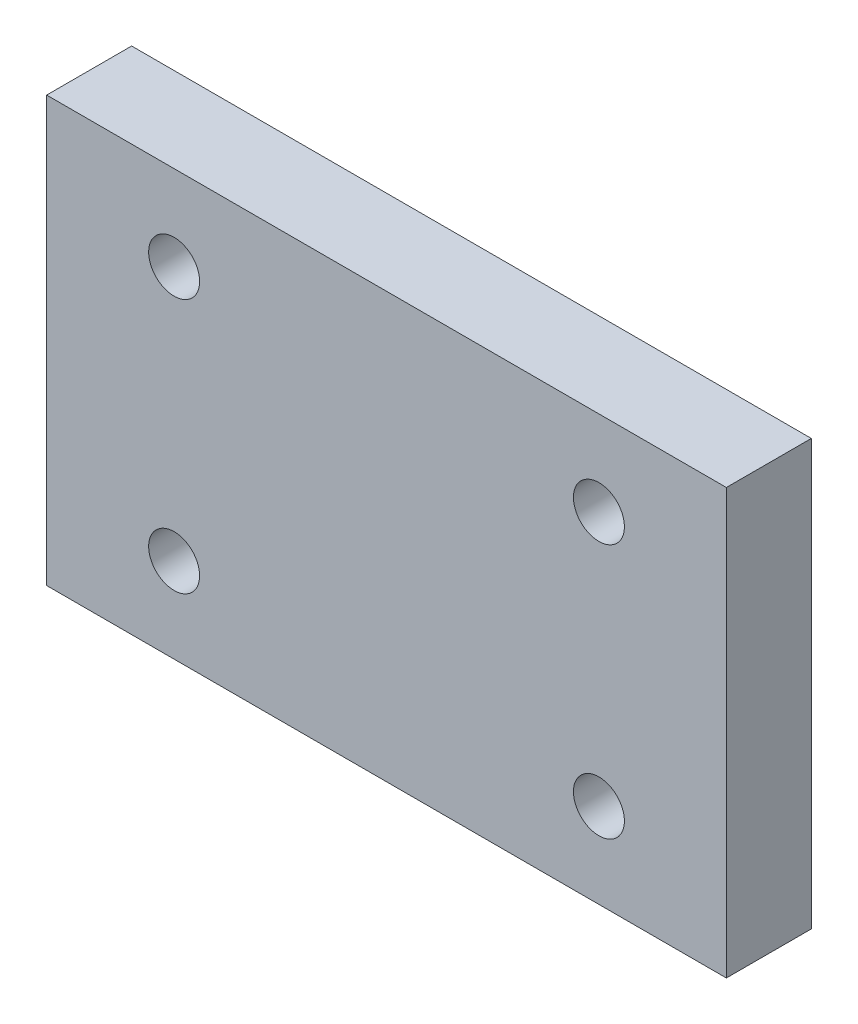
ISO-10303-21;
HEADER;
FILE_DESCRIPTION(('STEP AP214'),'2;1');
FILE_NAME('part.step','',(''),(''),'','','');
FILE_SCHEMA(('AUTOMOTIVE_DESIGN { 1 0 10303 214 1 1 1 1 }'));
ENDSEC;
DATA;
#1=APPLICATION_CONTEXT('core data for automotive mechanical design processes');
#2=APPLICATION_PROTOCOL_DEFINITION('international standard','automotive_design',2000,#1);
#3=PRODUCT_CONTEXT('',#1,'mechanical');
#4=PRODUCT('Part','Part','',(#3));
#5=PRODUCT_RELATED_PRODUCT_CATEGORY('part','',(#4));
#6=PRODUCT_DEFINITION_FORMATION('','',#4);
#7=PRODUCT_DEFINITION_CONTEXT('part definition',#1,'design');
#8=PRODUCT_DEFINITION('design','',#6,#7);
#9=PRODUCT_DEFINITION_SHAPE('','',#8);
#10=(LENGTH_UNIT() NAMED_UNIT(*) SI_UNIT(.MILLI.,.METRE.));
#11=(NAMED_UNIT(*) PLANE_ANGLE_UNIT() SI_UNIT($,.RADIAN.));
#12=(NAMED_UNIT(*) SI_UNIT($,.STERADIAN.) SOLID_ANGLE_UNIT());
#13=UNCERTAINTY_MEASURE_WITH_UNIT(LENGTH_MEASURE(1.E-05),#10,'distance_accuracy_value','');
#14=(GEOMETRIC_REPRESENTATION_CONTEXT(3) GLOBAL_UNCERTAINTY_ASSIGNED_CONTEXT((#13)) GLOBAL_UNIT_ASSIGNED_CONTEXT((#10,
#11,#12)) REPRESENTATION_CONTEXT('',''));
#15=CARTESIAN_POINT('',(0.,0.,0.));
#16=DIRECTION('',(0.,0.,1.));
#17=DIRECTION('',(1.,0.,0.));
#18=AXIS2_PLACEMENT_3D('',#15,#16,#17);
#19=CARTESIAN_POINT('',(40.,-25.,10.));
#20=DIRECTION('',(-1.,0.,0.));
#21=DIRECTION('',(0.,0.,1.));
#22=AXIS2_PLACEMENT_3D('',#19,#20,#21);
#23=PLANE('',#22);
#24=DIRECTION('',(0.,1.,0.));
#25=VECTOR('',#24,1.);
#26=CARTESIAN_POINT('',(40.,-25.,0.));
#27=LINE('',#26,#25);
#28=CARTESIAN_POINT('',(40.,-25.,0.));
#29=VERTEX_POINT('',#28);
#30=CARTESIAN_POINT('',(40.,25.,0.));
#31=VERTEX_POINT('',#30);
#32=EDGE_CURVE('E111',#29,#31,#27,.T.);
#33=ORIENTED_EDGE('',*,*,#32,.T.);
#34=DIRECTION('',(0.,0.,-1.));
#35=VECTOR('',#34,1.);
#36=CARTESIAN_POINT('',(40.,25.,10.));
#37=LINE('',#36,#35);
#38=CARTESIAN_POINT('',(40.,25.,10.));
#39=VERTEX_POINT('',#38);
#40=EDGE_CURVE('E11',#39,#31,#37,.T.);
#41=ORIENTED_EDGE('',*,*,#40,.F.);
#42=DIRECTION('',(0.,1.,0.));
#43=VECTOR('',#42,1.);
#44=CARTESIAN_POINT('',(40.,-25.,10.));
#45=LINE('',#44,#43);
#46=CARTESIAN_POINT('',(40.,-25.,10.));
#47=VERTEX_POINT('',#46);
#48=EDGE_CURVE('E99',#47,#39,#45,.T.);
#49=ORIENTED_EDGE('',*,*,#48,.F.);
#50=DIRECTION('',(0.,0.,-1.));
#51=VECTOR('',#50,1.);
#52=CARTESIAN_POINT('',(40.,-25.,10.));
#53=LINE('',#52,#51);
#54=EDGE_CURVE('E107',#47,#29,#53,.T.);
#55=ORIENTED_EDGE('',*,*,#54,.T.);
#56=EDGE_LOOP('',(#33,#41,#49,#55));
#57=FACE_BOUND('',#56,.T.);
#58=ADVANCED_FACE('F47',(#57),#23,.F.);
#59=CARTESIAN_POINT('',(-40.,25.,10.));
#60=DIRECTION('',(0.,-1.,0.));
#61=DIRECTION('',(0.,0.,-1.));
#62=AXIS2_PLACEMENT_3D('',#59,#60,#61);
#63=PLANE('',#62);
#64=DIRECTION('',(-1.,0.,0.));
#65=VECTOR('',#64,1.);
#66=CARTESIAN_POINT('',(-40.,25.,0.));
#67=LINE('',#66,#65);
#68=CARTESIAN_POINT('',(-40.,25.,0.));
#69=VERTEX_POINT('',#68);
#70=EDGE_CURVE('E103',#31,#69,#67,.T.);
#71=ORIENTED_EDGE('',*,*,#70,.T.);
#72=DIRECTION('',(0.,0.,-1.));
#73=VECTOR('',#72,1.);
#74=CARTESIAN_POINT('',(-40.,25.,10.));
#75=LINE('',#74,#73);
#76=CARTESIAN_POINT('',(-40.,25.,10.));
#77=VERTEX_POINT('',#76);
#78=EDGE_CURVE('E56',#77,#69,#75,.T.);
#79=ORIENTED_EDGE('',*,*,#78,.F.);
#80=DIRECTION('',(-1.,0.,0.));
#81=VECTOR('',#80,1.);
#82=CARTESIAN_POINT('',(-40.,25.,10.));
#83=LINE('',#82,#81);
#84=EDGE_CURVE('E94',#39,#77,#83,.T.);
#85=ORIENTED_EDGE('',*,*,#84,.F.);
#86=ORIENTED_EDGE('',*,*,#40,.T.);
#87=EDGE_LOOP('',(#71,#79,#85,#86));
#88=FACE_BOUND('',#87,.T.);
#89=ADVANCED_FACE('F102',(#88),#63,.F.);
#90=CARTESIAN_POINT('',(-40.,-25.,10.));
#91=DIRECTION('',(1.,0.,0.));
#92=DIRECTION('',(0.,0.,-1.));
#93=AXIS2_PLACEMENT_3D('',#90,#91,#92);
#94=PLANE('',#93);
#95=DIRECTION('',(0.,-1.,0.));
#96=VECTOR('',#95,1.);
#97=CARTESIAN_POINT('',(-40.,-25.,0.));
#98=LINE('',#97,#96);
#99=CARTESIAN_POINT('',(-40.,-25.,0.));
#100=VERTEX_POINT('',#99);
#101=EDGE_CURVE('E81',#69,#100,#98,.T.);
#102=ORIENTED_EDGE('',*,*,#101,.T.);
#103=DIRECTION('',(0.,0.,-1.));
#104=VECTOR('',#103,1.);
#105=CARTESIAN_POINT('',(-40.,-25.,10.));
#106=LINE('',#105,#104);
#107=CARTESIAN_POINT('',(-40.,-25.,10.));
#108=VERTEX_POINT('',#107);
#109=EDGE_CURVE('E104',#108,#100,#106,.T.);
#110=ORIENTED_EDGE('',*,*,#109,.F.);
#111=DIRECTION('',(0.,-1.,0.));
#112=VECTOR('',#111,1.);
#113=CARTESIAN_POINT('',(-40.,-25.,10.));
#114=LINE('',#113,#112);
#115=EDGE_CURVE('E97',#77,#108,#114,.T.);
#116=ORIENTED_EDGE('',*,*,#115,.F.);
#117=ORIENTED_EDGE('',*,*,#78,.T.);
#118=EDGE_LOOP('',(#102,#110,#116,#117));
#119=FACE_BOUND('',#118,.T.);
#120=ADVANCED_FACE('F105',(#119),#94,.F.);
#121=CARTESIAN_POINT('',(-40.,-25.,10.));
#122=DIRECTION('',(0.,1.,0.));
#123=DIRECTION('',(0.,0.,1.));
#124=AXIS2_PLACEMENT_3D('',#121,#122,#123);
#125=PLANE('',#124);
#126=DIRECTION('',(1.,0.,0.));
#127=VECTOR('',#126,1.);
#128=CARTESIAN_POINT('',(-40.,-25.,0.));
#129=LINE('',#128,#127);
#130=EDGE_CURVE('E87',#100,#29,#129,.T.);
#131=ORIENTED_EDGE('',*,*,#130,.T.);
#132=ORIENTED_EDGE('',*,*,#54,.F.);
#133=DIRECTION('',(1.,0.,0.));
#134=VECTOR('',#133,1.);
#135=CARTESIAN_POINT('',(-40.,-25.,10.));
#136=LINE('',#135,#134);
#137=EDGE_CURVE('E64',#108,#47,#136,.T.);
#138=ORIENTED_EDGE('',*,*,#137,.F.);
#139=ORIENTED_EDGE('',*,*,#109,.T.);
#140=EDGE_LOOP('',(#131,#132,#138,#139));
#141=FACE_BOUND('',#140,.T.);
#142=ADVANCED_FACE('F119',(#141),#125,.F.);
#143=CARTESIAN_POINT('',(0.,0.,10.));
#144=DIRECTION('',(0.,0.,-1.));
#145=DIRECTION('',(-1.,0.,0.));
#146=AXIS2_PLACEMENT_3D('',#143,#144,#145);
#147=PLANE('',#146);
#148=CARTESIAN_POINT('',(-25.,-15.,10.));
#149=DIRECTION('',(0.,0.,-1.));
#150=DIRECTION('',(-1.,0.,0.));
#151=AXIS2_PLACEMENT_3D('',#148,#149,#150);
#152=CIRCLE('',#151,3.);
#153=CARTESIAN_POINT('',(-28.,-15.,10.));
#154=VERTEX_POINT('',#153);
#155=EDGE_CURVE('E128',#154,#154,#152,.T.);
#156=ORIENTED_EDGE('',*,*,#155,.T.);
#157=EDGE_LOOP('',(#156));
#158=FACE_BOUND('',#157,.T.);
#159=CARTESIAN_POINT('',(25.,15.,10.));
#160=DIRECTION('',(0.,0.,-1.));
#161=DIRECTION('',(-1.,0.,0.));
#162=AXIS2_PLACEMENT_3D('',#159,#160,#161);
#163=CIRCLE('',#162,3.);
#164=CARTESIAN_POINT('',(22.,15.,10.));
#165=VERTEX_POINT('',#164);
#166=EDGE_CURVE('E134',#165,#165,#163,.T.);
#167=ORIENTED_EDGE('',*,*,#166,.T.);
#168=EDGE_LOOP('',(#167));
#169=FACE_BOUND('',#168,.T.);
#170=CARTESIAN_POINT('',(25.,-15.,10.));
#171=DIRECTION('',(0.,0.,-1.));
#172=DIRECTION('',(-1.,0.,0.));
#173=AXIS2_PLACEMENT_3D('',#170,#171,#172);
#174=CIRCLE('',#173,3.);
#175=CARTESIAN_POINT('',(22.,-15.,10.));
#176=VERTEX_POINT('',#175);
#177=EDGE_CURVE('E135',#176,#176,#174,.T.);
#178=ORIENTED_EDGE('',*,*,#177,.T.);
#179=EDGE_LOOP('',(#178));
#180=FACE_BOUND('',#179,.T.);
#181=CARTESIAN_POINT('',(-25.,15.,10.));
#182=DIRECTION('',(0.,0.,-1.));
#183=DIRECTION('',(-1.,0.,0.));
#184=AXIS2_PLACEMENT_3D('',#181,#182,#183);
#185=CIRCLE('',#184,3.);
#186=CARTESIAN_POINT('',(-28.,15.,10.));
#187=VERTEX_POINT('',#186);
#188=EDGE_CURVE('E125',#187,#187,#185,.T.);
#189=ORIENTED_EDGE('',*,*,#188,.T.);
#190=EDGE_LOOP('',(#189));
#191=FACE_BOUND('',#190,.T.);
#192=ORIENTED_EDGE('',*,*,#48,.T.);
#193=ORIENTED_EDGE('',*,*,#84,.T.);
#194=ORIENTED_EDGE('',*,*,#115,.T.);
#195=ORIENTED_EDGE('',*,*,#137,.T.);
#196=EDGE_LOOP('',(#192,#193,#194,#195));
#197=FACE_BOUND('',#196,.T.);
#198=ADVANCED_FACE('F95',(#158,#169,#180,#191,#197),#147,.F.);
#199=CARTESIAN_POINT('',(0.,0.,0.));
#200=DIRECTION('',(0.,0.,-1.));
#201=DIRECTION('',(-1.,0.,0.));
#202=AXIS2_PLACEMENT_3D('',#199,#200,#201);
#203=PLANE('',#202);
#204=CARTESIAN_POINT('',(-25.,-15.,0.));
#205=DIRECTION('',(0.,0.,-1.));
#206=DIRECTION('',(-1.,0.,0.));
#207=AXIS2_PLACEMENT_3D('',#204,#205,#206);
#208=CIRCLE('',#207,3.);
#209=CARTESIAN_POINT('',(-28.,-15.,0.));
#210=VERTEX_POINT('',#209);
#211=EDGE_CURVE('E138',#210,#210,#208,.T.);
#212=ORIENTED_EDGE('',*,*,#211,.F.);
#213=EDGE_LOOP('',(#212));
#214=FACE_BOUND('',#213,.T.);
#215=CARTESIAN_POINT('',(25.,15.,0.));
#216=DIRECTION('',(0.,0.,-1.));
#217=DIRECTION('',(-1.,0.,0.));
#218=AXIS2_PLACEMENT_3D('',#215,#216,#217);
#219=CIRCLE('',#218,3.);
#220=CARTESIAN_POINT('',(22.,15.,0.));
#221=VERTEX_POINT('',#220);
#222=EDGE_CURVE('E131',#221,#221,#219,.T.);
#223=ORIENTED_EDGE('',*,*,#222,.F.);
#224=EDGE_LOOP('',(#223));
#225=FACE_BOUND('',#224,.T.);
#226=CARTESIAN_POINT('',(25.,-15.,0.));
#227=DIRECTION('',(0.,0.,-1.));
#228=DIRECTION('',(-1.,0.,0.));
#229=AXIS2_PLACEMENT_3D('',#226,#227,#228);
#230=CIRCLE('',#229,3.);
#231=CARTESIAN_POINT('',(22.,-15.,0.));
#232=VERTEX_POINT('',#231);
#233=EDGE_CURVE('E143',#232,#232,#230,.T.);
#234=ORIENTED_EDGE('',*,*,#233,.F.);
#235=EDGE_LOOP('',(#234));
#236=FACE_BOUND('',#235,.T.);
#237=CARTESIAN_POINT('',(-25.,15.,0.));
#238=DIRECTION('',(0.,0.,-1.));
#239=DIRECTION('',(-1.,0.,0.));
#240=AXIS2_PLACEMENT_3D('',#237,#238,#239);
#241=CIRCLE('',#240,3.);
#242=CARTESIAN_POINT('',(-28.,15.,0.));
#243=VERTEX_POINT('',#242);
#244=EDGE_CURVE('E114',#243,#243,#241,.T.);
#245=ORIENTED_EDGE('',*,*,#244,.F.);
#246=EDGE_LOOP('',(#245));
#247=FACE_BOUND('',#246,.T.);
#248=ORIENTED_EDGE('',*,*,#32,.F.);
#249=ORIENTED_EDGE('',*,*,#130,.F.);
#250=ORIENTED_EDGE('',*,*,#101,.F.);
#251=ORIENTED_EDGE('',*,*,#70,.F.);
#252=EDGE_LOOP('',(#248,#249,#250,#251));
#253=FACE_BOUND('',#252,.T.);
#254=ADVANCED_FACE('F122',(#214,#225,#236,#247,#253),#203,.T.);
#255=CARTESIAN_POINT('',(-25.,15.,0.));
#256=DIRECTION('',(0.,0.,1.));
#257=DIRECTION('',(1.,0.,0.));
#258=AXIS2_PLACEMENT_3D('',#255,#256,#257);
#259=CYLINDRICAL_SURFACE('',#258,3.);
#260=ORIENTED_EDGE('',*,*,#244,.T.);
#261=EDGE_LOOP('',(#260));
#262=FACE_BOUND('',#261,.T.);
#263=ORIENTED_EDGE('',*,*,#188,.F.);
#264=EDGE_LOOP('',(#263));
#265=FACE_BOUND('',#264,.T.);
#266=ADVANCED_FACE('F154',(#262,#265),#259,.F.);
#267=CARTESIAN_POINT('',(25.,-15.,0.));
#268=DIRECTION('',(0.,0.,1.));
#269=DIRECTION('',(1.,0.,0.));
#270=AXIS2_PLACEMENT_3D('',#267,#268,#269);
#271=CYLINDRICAL_SURFACE('',#270,3.);
#272=ORIENTED_EDGE('',*,*,#233,.T.);
#273=EDGE_LOOP('',(#272));
#274=FACE_BOUND('',#273,.T.);
#275=ORIENTED_EDGE('',*,*,#177,.F.);
#276=EDGE_LOOP('',(#275));
#277=FACE_BOUND('',#276,.T.);
#278=ADVANCED_FACE('F151',(#274,#277),#271,.F.);
#279=CARTESIAN_POINT('',(25.,15.,0.));
#280=DIRECTION('',(0.,0.,1.));
#281=DIRECTION('',(1.,0.,0.));
#282=AXIS2_PLACEMENT_3D('',#279,#280,#281);
#283=CYLINDRICAL_SURFACE('',#282,3.);
#284=ORIENTED_EDGE('',*,*,#222,.T.);
#285=EDGE_LOOP('',(#284));
#286=FACE_BOUND('',#285,.T.);
#287=ORIENTED_EDGE('',*,*,#166,.F.);
#288=EDGE_LOOP('',(#287));
#289=FACE_BOUND('',#288,.T.);
#290=ADVANCED_FACE('F153',(#286,#289),#283,.F.);
#291=CARTESIAN_POINT('',(-25.,-15.,0.));
#292=DIRECTION('',(0.,0.,1.));
#293=DIRECTION('',(1.,0.,0.));
#294=AXIS2_PLACEMENT_3D('',#291,#292,#293);
#295=CYLINDRICAL_SURFACE('',#294,3.);
#296=ORIENTED_EDGE('',*,*,#211,.T.);
#297=EDGE_LOOP('',(#296));
#298=FACE_BOUND('',#297,.T.);
#299=ORIENTED_EDGE('',*,*,#155,.F.);
#300=EDGE_LOOP('',(#299));
#301=FACE_BOUND('',#300,.T.);
#302=ADVANCED_FACE('F160',(#298,#301),#295,.F.);
#303=CLOSED_SHELL('',(#58,#89,#120,#142,#198,#254,#266,#278,#290,#302));
#304=MANIFOLD_SOLID_BREP('B2',#303);
#305=ADVANCED_BREP_SHAPE_REPRESENTATION('',(#18,#304),#14);
#306=SHAPE_DEFINITION_REPRESENTATION(#9,#305);
ENDSEC;
END-ISO-10303-21;
